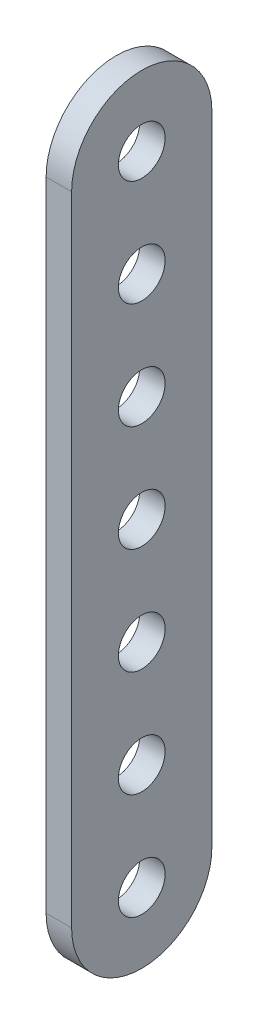
ISO-10303-21;
HEADER;
FILE_DESCRIPTION(('STEP AP214'),'2;1');
FILE_NAME('part.step','',(''),(''),'','','');
FILE_SCHEMA(('AUTOMOTIVE_DESIGN { 1 0 10303 214 1 1 1 1 }'));
ENDSEC;
DATA;
#1=APPLICATION_CONTEXT('core data for automotive mechanical design processes');
#2=APPLICATION_PROTOCOL_DEFINITION('international standard','automotive_design',2000,#1);
#3=PRODUCT_CONTEXT('',#1,'mechanical');
#4=PRODUCT('Part','Part','',(#3));
#5=PRODUCT_RELATED_PRODUCT_CATEGORY('part','',(#4));
#6=PRODUCT_DEFINITION_FORMATION('','',#4);
#7=PRODUCT_DEFINITION_CONTEXT('part definition',#1,'design');
#8=PRODUCT_DEFINITION('design','',#6,#7);
#9=PRODUCT_DEFINITION_SHAPE('','',#8);
#10=(LENGTH_UNIT() NAMED_UNIT(*) SI_UNIT(.MILLI.,.METRE.));
#11=(NAMED_UNIT(*) PLANE_ANGLE_UNIT() SI_UNIT($,.RADIAN.));
#12=(NAMED_UNIT(*) SI_UNIT($,.STERADIAN.) SOLID_ANGLE_UNIT());
#13=UNCERTAINTY_MEASURE_WITH_UNIT(LENGTH_MEASURE(1.E-05),#10,'distance_accuracy_value','');
#14=(GEOMETRIC_REPRESENTATION_CONTEXT(3) GLOBAL_UNCERTAINTY_ASSIGNED_CONTEXT((#13)) GLOBAL_UNIT_ASSIGNED_CONTEXT((#10,
#11,#12)) REPRESENTATION_CONTEXT('',''));
#15=CARTESIAN_POINT('',(0.,0.,0.));
#16=DIRECTION('',(0.,0.,1.));
#17=DIRECTION('',(1.,0.,0.));
#18=AXIS2_PLACEMENT_3D('',#15,#16,#17);
#19=CARTESIAN_POINT('',(18.0582190859894,42.5000000000003,-49.9999999999998));
#20=DIRECTION('',(1.,0.,0.));
#21=DIRECTION('',(0.,0.,-1.));
#22=AXIS2_PLACEMENT_3D('',#19,#20,#21);
#23=PLANE('',#22);
#24=CARTESIAN_POINT('',(18.0582190859894,-20.,-49.9999999999998));
#25=DIRECTION('',(1.,0.,0.));
#26=DIRECTION('',(0.,0.,-1.));
#27=AXIS2_PLACEMENT_3D('',#24,#25,#26);
#28=CIRCLE('',#27,2.74999999999998);
#29=CARTESIAN_POINT('',(18.0582190859894,-20.,-52.7499999999998));
#30=VERTEX_POINT('',#29);
#31=EDGE_CURVE('E180',#30,#30,#28,.T.);
#32=ORIENTED_EDGE('',*,*,#31,.F.);
#33=EDGE_LOOP('',(#32));
#34=FACE_BOUND('',#33,.T.);
#35=CARTESIAN_POINT('',(18.0582190859894,30.0000000000002,-49.9999999999998));
#36=DIRECTION('',(1.,0.,0.));
#37=DIRECTION('',(0.,0.,-1.));
#38=AXIS2_PLACEMENT_3D('',#35,#36,#37);
#39=CIRCLE('',#38,2.74999999999998);
#40=CARTESIAN_POINT('',(18.0582190859894,30.0000000000002,-52.7499999999998));
#41=VERTEX_POINT('',#40);
#42=EDGE_CURVE('E163',#41,#41,#39,.T.);
#43=ORIENTED_EDGE('',*,*,#42,.F.);
#44=EDGE_LOOP('',(#43));
#45=FACE_BOUND('',#44,.T.);
#46=CARTESIAN_POINT('',(18.0582190859894,5.00000000000013,-49.9999999999998));
#47=DIRECTION('',(1.,0.,0.));
#48=DIRECTION('',(0.,0.,-1.));
#49=AXIS2_PLACEMENT_3D('',#46,#47,#48);
#50=CIRCLE('',#49,2.74999999999998);
#51=CARTESIAN_POINT('',(18.0582190859894,5.00000000000013,-52.7499999999998));
#52=VERTEX_POINT('',#51);
#53=EDGE_CURVE('E148',#52,#52,#50,.T.);
#54=ORIENTED_EDGE('',*,*,#53,.F.);
#55=EDGE_LOOP('',(#54));
#56=FACE_BOUND('',#55,.T.);
#57=CARTESIAN_POINT('',(18.0582190859894,42.5000000000003,-49.9999999999998));
#58=DIRECTION('',(1.,0.,0.));
#59=DIRECTION('',(0.,0.,-1.));
#60=AXIS2_PLACEMENT_3D('',#57,#58,#59);
#61=CIRCLE('',#60,8.24999999999998);
#62=CARTESIAN_POINT('',(18.0582190859894,42.5000000000003,-58.2499999999998));
#63=VERTEX_POINT('',#62);
#64=CARTESIAN_POINT('',(18.0582190859894,42.5000000000003,-41.7499999999998));
#65=VERTEX_POINT('',#64);
#66=EDGE_CURVE('E107',#63,#65,#61,.T.);
#67=ORIENTED_EDGE('',*,*,#66,.T.);
#68=DIRECTION('',(0.,-1.,0.));
#69=VECTOR('',#68,1.);
#70=CARTESIAN_POINT('',(18.0582190859894,42.5000000000003,-41.7499999999998));
#71=LINE('',#70,#69);
#72=CARTESIAN_POINT('',(18.0582190859894,-32.5000000000001,-41.7499999999998));
#73=VERTEX_POINT('',#72);
#74=EDGE_CURVE('E102',#65,#73,#71,.T.);
#75=ORIENTED_EDGE('',*,*,#74,.T.);
#76=CARTESIAN_POINT('',(18.0582190859894,-32.5000000000001,-49.9999999999998));
#77=DIRECTION('',(1.,0.,0.));
#78=DIRECTION('',(0.,0.,-1.));
#79=AXIS2_PLACEMENT_3D('',#76,#77,#78);
#80=CIRCLE('',#79,8.24999999999998);
#81=CARTESIAN_POINT('',(18.0582190859894,-32.5000000000001,-58.2499999999998));
#82=VERTEX_POINT('',#81);
#83=EDGE_CURVE('E105',#73,#82,#80,.T.);
#84=ORIENTED_EDGE('',*,*,#83,.T.);
#85=DIRECTION('',(0.,1.,0.));
#86=VECTOR('',#85,1.);
#87=CARTESIAN_POINT('',(18.0582190859894,42.5000000000003,-58.2499999999998));
#88=LINE('',#87,#86);
#89=EDGE_CURVE('E72',#82,#63,#88,.T.);
#90=ORIENTED_EDGE('',*,*,#89,.T.);
#91=EDGE_LOOP('',(#67,#75,#84,#90));
#92=FACE_BOUND('',#91,.T.);
#93=CARTESIAN_POINT('',(18.0582190859894,-7.49999999999994,-49.9999999999998));
#94=DIRECTION('',(1.,0.,0.));
#95=DIRECTION('',(0.,0.,-1.));
#96=AXIS2_PLACEMENT_3D('',#93,#94,#95);
#97=CIRCLE('',#96,2.74999999999998);
#98=CARTESIAN_POINT('',(18.0582190859894,-7.49999999999994,-52.7499999999998));
#99=VERTEX_POINT('',#98);
#100=EDGE_CURVE('E136',#99,#99,#97,.T.);
#101=ORIENTED_EDGE('',*,*,#100,.F.);
#102=EDGE_LOOP('',(#101));
#103=FACE_BOUND('',#102,.T.);
#104=CARTESIAN_POINT('',(18.0582190859894,17.5000000000002,-49.9999999999998));
#105=DIRECTION('',(1.,0.,0.));
#106=DIRECTION('',(0.,0.,-1.));
#107=AXIS2_PLACEMENT_3D('',#104,#105,#106);
#108=CIRCLE('',#107,2.74999999999998);
#109=CARTESIAN_POINT('',(18.0582190859894,17.5000000000002,-52.7499999999998));
#110=VERTEX_POINT('',#109);
#111=EDGE_CURVE('E162',#110,#110,#108,.T.);
#112=ORIENTED_EDGE('',*,*,#111,.F.);
#113=EDGE_LOOP('',(#112));
#114=FACE_BOUND('',#113,.T.);
#115=CARTESIAN_POINT('',(18.0582190859894,42.5000000000003,-49.9999999999998));
#116=DIRECTION('',(1.,0.,0.));
#117=DIRECTION('',(0.,0.,-1.));
#118=AXIS2_PLACEMENT_3D('',#115,#116,#117);
#119=CIRCLE('',#118,2.75);
#120=CARTESIAN_POINT('',(18.0582190859894,42.5000000000003,-52.7499999999998));
#121=VERTEX_POINT('',#120);
#122=EDGE_CURVE('E171',#121,#121,#119,.T.);
#123=ORIENTED_EDGE('',*,*,#122,.F.);
#124=EDGE_LOOP('',(#123));
#125=FACE_BOUND('',#124,.T.);
#126=CARTESIAN_POINT('',(18.0582190859894,-32.5000000000001,-49.9999999999998));
#127=DIRECTION('',(1.,0.,0.));
#128=DIRECTION('',(0.,0.,-1.));
#129=AXIS2_PLACEMENT_3D('',#126,#127,#128);
#130=CIRCLE('',#129,2.74999999999998);
#131=CARTESIAN_POINT('',(18.0582190859894,-32.5000000000001,-52.7499999999998));
#132=VERTEX_POINT('',#131);
#133=EDGE_CURVE('E189',#132,#132,#130,.T.);
#134=ORIENTED_EDGE('',*,*,#133,.F.);
#135=EDGE_LOOP('',(#134));
#136=FACE_BOUND('',#135,.T.);
#137=ADVANCED_FACE('F54',(#34,#45,#56,#92,#103,#114,#125,#136),#23,.T.);
#138=CARTESIAN_POINT('',(15.0582190859894,42.5000000000003,-49.9999999999998));
#139=DIRECTION('',(1.,0.,0.));
#140=DIRECTION('',(0.,0.,-1.));
#141=AXIS2_PLACEMENT_3D('',#138,#139,#140);
#142=PLANE('',#141);
#143=CARTESIAN_POINT('',(15.0582190859894,42.5000000000003,-49.9999999999998));
#144=DIRECTION('',(1.,0.,0.));
#145=DIRECTION('',(0.,0.,-1.));
#146=AXIS2_PLACEMENT_3D('',#143,#144,#145);
#147=CIRCLE('',#146,8.24999999999998);
#148=CARTESIAN_POINT('',(15.0582190859894,42.5000000000003,-58.2499999999998));
#149=VERTEX_POINT('',#148);
#150=CARTESIAN_POINT('',(15.0582190859894,42.5000000000003,-41.7499999999998));
#151=VERTEX_POINT('',#150);
#152=EDGE_CURVE('E142',#149,#151,#147,.T.);
#153=ORIENTED_EDGE('',*,*,#152,.F.);
#154=DIRECTION('',(0.,1.,0.));
#155=VECTOR('',#154,1.);
#156=CARTESIAN_POINT('',(15.0582190859894,42.5000000000003,-58.2499999999998));
#157=LINE('',#156,#155);
#158=CARTESIAN_POINT('',(15.0582190859894,-32.5000000000001,-58.2499999999998));
#159=VERTEX_POINT('',#158);
#160=EDGE_CURVE('E95',#159,#149,#157,.T.);
#161=ORIENTED_EDGE('',*,*,#160,.F.);
#162=CARTESIAN_POINT('',(15.0582190859894,-32.5000000000001,-49.9999999999998));
#163=DIRECTION('',(1.,0.,0.));
#164=DIRECTION('',(0.,0.,-1.));
#165=AXIS2_PLACEMENT_3D('',#162,#163,#164);
#166=CIRCLE('',#165,8.24999999999998);
#167=CARTESIAN_POINT('',(15.0582190859894,-32.5000000000001,-41.7499999999998));
#168=VERTEX_POINT('',#167);
#169=EDGE_CURVE('E89',#168,#159,#166,.T.);
#170=ORIENTED_EDGE('',*,*,#169,.F.);
#171=DIRECTION('',(0.,-1.,0.));
#172=VECTOR('',#171,1.);
#173=CARTESIAN_POINT('',(15.0582190859894,42.5000000000003,-41.7499999999998));
#174=LINE('',#173,#172);
#175=EDGE_CURVE('E112',#151,#168,#174,.T.);
#176=ORIENTED_EDGE('',*,*,#175,.F.);
#177=EDGE_LOOP('',(#153,#161,#170,#176));
#178=FACE_BOUND('',#177,.T.);
#179=CARTESIAN_POINT('',(15.0582190859894,-7.49999999999994,-49.9999999999998));
#180=DIRECTION('',(1.,0.,0.));
#181=DIRECTION('',(0.,0.,-1.));
#182=AXIS2_PLACEMENT_3D('',#179,#180,#181);
#183=CIRCLE('',#182,2.74999999999998);
#184=CARTESIAN_POINT('',(15.0582190859894,-7.49999999999994,-52.7499999999998));
#185=VERTEX_POINT('',#184);
#186=EDGE_CURVE('E143',#185,#185,#183,.T.);
#187=ORIENTED_EDGE('',*,*,#186,.T.);
#188=EDGE_LOOP('',(#187));
#189=FACE_BOUND('',#188,.T.);
#190=CARTESIAN_POINT('',(15.0582190859894,5.00000000000013,-49.9999999999998));
#191=DIRECTION('',(1.,0.,0.));
#192=DIRECTION('',(0.,0.,-1.));
#193=AXIS2_PLACEMENT_3D('',#190,#191,#192);
#194=CIRCLE('',#193,2.74999999999998);
#195=CARTESIAN_POINT('',(15.0582190859894,5.00000000000013,-52.7499999999998));
#196=VERTEX_POINT('',#195);
#197=EDGE_CURVE('E144',#196,#196,#194,.T.);
#198=ORIENTED_EDGE('',*,*,#197,.T.);
#199=EDGE_LOOP('',(#198));
#200=FACE_BOUND('',#199,.T.);
#201=CARTESIAN_POINT('',(15.0582190859894,17.5000000000002,-49.9999999999998));
#202=DIRECTION('',(1.,0.,0.));
#203=DIRECTION('',(0.,0.,-1.));
#204=AXIS2_PLACEMENT_3D('',#201,#202,#203);
#205=CIRCLE('',#204,2.74999999999998);
#206=CARTESIAN_POINT('',(15.0582190859894,17.5000000000002,-52.7499999999998));
#207=VERTEX_POINT('',#206);
#208=EDGE_CURVE('E159',#207,#207,#205,.T.);
#209=ORIENTED_EDGE('',*,*,#208,.T.);
#210=EDGE_LOOP('',(#209));
#211=FACE_BOUND('',#210,.T.);
#212=CARTESIAN_POINT('',(15.0582190859894,30.0000000000002,-49.9999999999998));
#213=DIRECTION('',(1.,0.,0.));
#214=DIRECTION('',(0.,0.,-1.));
#215=AXIS2_PLACEMENT_3D('',#212,#213,#214);
#216=CIRCLE('',#215,2.74999999999998);
#217=CARTESIAN_POINT('',(15.0582190859894,30.0000000000002,-52.7499999999998));
#218=VERTEX_POINT('',#217);
#219=EDGE_CURVE('E168',#218,#218,#216,.T.);
#220=ORIENTED_EDGE('',*,*,#219,.T.);
#221=EDGE_LOOP('',(#220));
#222=FACE_BOUND('',#221,.T.);
#223=CARTESIAN_POINT('',(15.0582190859894,42.5000000000003,-49.9999999999998));
#224=DIRECTION('',(1.,0.,0.));
#225=DIRECTION('',(0.,0.,-1.));
#226=AXIS2_PLACEMENT_3D('',#223,#224,#225);
#227=CIRCLE('',#226,2.75);
#228=CARTESIAN_POINT('',(15.0582190859894,42.5000000000003,-52.7499999999998));
#229=VERTEX_POINT('',#228);
#230=EDGE_CURVE('E176',#229,#229,#227,.T.);
#231=ORIENTED_EDGE('',*,*,#230,.T.);
#232=EDGE_LOOP('',(#231));
#233=FACE_BOUND('',#232,.T.);
#234=CARTESIAN_POINT('',(15.0582190859894,-20.,-49.9999999999998));
#235=DIRECTION('',(1.,0.,0.));
#236=DIRECTION('',(0.,0.,-1.));
#237=AXIS2_PLACEMENT_3D('',#234,#235,#236);
#238=CIRCLE('',#237,2.74999999999998);
#239=CARTESIAN_POINT('',(15.0582190859894,-20.,-52.7499999999998));
#240=VERTEX_POINT('',#239);
#241=EDGE_CURVE('E185',#240,#240,#238,.T.);
#242=ORIENTED_EDGE('',*,*,#241,.T.);
#243=EDGE_LOOP('',(#242));
#244=FACE_BOUND('',#243,.T.);
#245=CARTESIAN_POINT('',(15.0582190859894,-32.5000000000001,-49.9999999999998));
#246=DIRECTION('',(1.,0.,0.));
#247=DIRECTION('',(0.,0.,-1.));
#248=AXIS2_PLACEMENT_3D('',#245,#246,#247);
#249=CIRCLE('',#248,2.74999999999998);
#250=CARTESIAN_POINT('',(15.0582190859894,-32.5000000000001,-52.7499999999998));
#251=VERTEX_POINT('',#250);
#252=EDGE_CURVE('E194',#251,#251,#249,.T.);
#253=ORIENTED_EDGE('',*,*,#252,.T.);
#254=EDGE_LOOP('',(#253));
#255=FACE_BOUND('',#254,.T.);
#256=ADVANCED_FACE('F209',(#178,#189,#200,#211,#222,#233,#244,#255),#142,.F.);
#257=CARTESIAN_POINT('',(18.0582190859894,42.5000000000003,-49.9999999999998));
#258=DIRECTION('',(-1.,0.,0.));
#259=DIRECTION('',(0.,0.,1.));
#260=AXIS2_PLACEMENT_3D('',#257,#258,#259);
#261=CYLINDRICAL_SURFACE('',#260,8.24999999999998);
#262=ORIENTED_EDGE('',*,*,#152,.T.);
#263=DIRECTION('',(-1.,0.,0.));
#264=VECTOR('',#263,1.);
#265=CARTESIAN_POINT('',(18.0582190859894,42.5000000000003,-41.7499999999998));
#266=LINE('',#265,#264);
#267=EDGE_CURVE('E12',#65,#151,#266,.T.);
#268=ORIENTED_EDGE('',*,*,#267,.F.);
#269=ORIENTED_EDGE('',*,*,#66,.F.);
#270=DIRECTION('',(-1.,0.,0.));
#271=VECTOR('',#270,1.);
#272=CARTESIAN_POINT('',(18.0582190859894,42.5000000000003,-58.2499999999998));
#273=LINE('',#272,#271);
#274=EDGE_CURVE('E121',#63,#149,#273,.T.);
#275=ORIENTED_EDGE('',*,*,#274,.T.);
#276=EDGE_LOOP('',(#262,#268,#269,#275));
#277=FACE_BOUND('',#276,.T.);
#278=ADVANCED_FACE('F56',(#277),#261,.T.);
#279=CARTESIAN_POINT('',(18.0582190859894,42.5000000000003,-41.7499999999998));
#280=DIRECTION('',(0.,0.,-1.));
#281=DIRECTION('',(0.,1.,0.));
#282=AXIS2_PLACEMENT_3D('',#279,#280,#281);
#283=PLANE('',#282);
#284=ORIENTED_EDGE('',*,*,#175,.T.);
#285=DIRECTION('',(-1.,0.,0.));
#286=VECTOR('',#285,1.);
#287=CARTESIAN_POINT('',(18.0582190859894,-32.5000000000001,-41.7499999999998));
#288=LINE('',#287,#286);
#289=EDGE_CURVE('E64',#73,#168,#288,.T.);
#290=ORIENTED_EDGE('',*,*,#289,.F.);
#291=ORIENTED_EDGE('',*,*,#74,.F.);
#292=ORIENTED_EDGE('',*,*,#267,.T.);
#293=EDGE_LOOP('',(#284,#290,#291,#292));
#294=FACE_BOUND('',#293,.T.);
#295=ADVANCED_FACE('F111',(#294),#283,.F.);
#296=CARTESIAN_POINT('',(18.0582190859894,-32.5000000000001,-49.9999999999998));
#297=DIRECTION('',(-1.,0.,0.));
#298=DIRECTION('',(0.,0.,1.));
#299=AXIS2_PLACEMENT_3D('',#296,#297,#298);
#300=CYLINDRICAL_SURFACE('',#299,8.24999999999998);
#301=ORIENTED_EDGE('',*,*,#169,.T.);
#302=DIRECTION('',(-1.,0.,0.));
#303=VECTOR('',#302,1.);
#304=CARTESIAN_POINT('',(18.0582190859894,-32.5000000000001,-58.2499999999998));
#305=LINE('',#304,#303);
#306=EDGE_CURVE('E114',#82,#159,#305,.T.);
#307=ORIENTED_EDGE('',*,*,#306,.F.);
#308=ORIENTED_EDGE('',*,*,#83,.F.);
#309=ORIENTED_EDGE('',*,*,#289,.T.);
#310=EDGE_LOOP('',(#301,#307,#308,#309));
#311=FACE_BOUND('',#310,.T.);
#312=ADVANCED_FACE('F115',(#311),#300,.T.);
#313=CARTESIAN_POINT('',(18.0582190859894,42.5000000000003,-58.2499999999998));
#314=DIRECTION('',(0.,0.,1.));
#315=DIRECTION('',(0.,-1.,0.));
#316=AXIS2_PLACEMENT_3D('',#313,#314,#315);
#317=PLANE('',#316);
#318=ORIENTED_EDGE('',*,*,#160,.T.);
#319=ORIENTED_EDGE('',*,*,#274,.F.);
#320=ORIENTED_EDGE('',*,*,#89,.F.);
#321=ORIENTED_EDGE('',*,*,#306,.T.);
#322=EDGE_LOOP('',(#318,#319,#320,#321));
#323=FACE_BOUND('',#322,.T.);
#324=ADVANCED_FACE('F222',(#323),#317,.F.);
#325=CARTESIAN_POINT('',(18.0582190859894,-7.49999999999994,-49.9999999999998));
#326=DIRECTION('',(-1.,0.,0.));
#327=DIRECTION('',(0.,0.,1.));
#328=AXIS2_PLACEMENT_3D('',#325,#326,#327);
#329=CYLINDRICAL_SURFACE('',#328,2.74999999999998);
#330=ORIENTED_EDGE('',*,*,#100,.T.);
#331=EDGE_LOOP('',(#330));
#332=FACE_BOUND('',#331,.T.);
#333=ORIENTED_EDGE('',*,*,#186,.F.);
#334=EDGE_LOOP('',(#333));
#335=FACE_BOUND('',#334,.T.);
#336=ADVANCED_FACE('F219',(#332,#335),#329,.F.);
#337=CARTESIAN_POINT('',(18.0582190859894,5.00000000000013,-49.9999999999998));
#338=DIRECTION('',(-1.,0.,0.));
#339=DIRECTION('',(0.,0.,1.));
#340=AXIS2_PLACEMENT_3D('',#337,#338,#339);
#341=CYLINDRICAL_SURFACE('',#340,2.74999999999998);
#342=ORIENTED_EDGE('',*,*,#53,.T.);
#343=EDGE_LOOP('',(#342));
#344=FACE_BOUND('',#343,.T.);
#345=ORIENTED_EDGE('',*,*,#197,.F.);
#346=EDGE_LOOP('',(#345));
#347=FACE_BOUND('',#346,.T.);
#348=ADVANCED_FACE('F275',(#344,#347),#341,.F.);
#349=CARTESIAN_POINT('',(18.0582190859894,17.5000000000002,-49.9999999999998));
#350=DIRECTION('',(-1.,0.,0.));
#351=DIRECTION('',(0.,0.,1.));
#352=AXIS2_PLACEMENT_3D('',#349,#350,#351);
#353=CYLINDRICAL_SURFACE('',#352,2.74999999999998);
#354=ORIENTED_EDGE('',*,*,#111,.T.);
#355=EDGE_LOOP('',(#354));
#356=FACE_BOUND('',#355,.T.);
#357=ORIENTED_EDGE('',*,*,#208,.F.);
#358=EDGE_LOOP('',(#357));
#359=FACE_BOUND('',#358,.T.);
#360=ADVANCED_FACE('F272',(#356,#359),#353,.F.);
#361=CARTESIAN_POINT('',(18.0582190859894,30.0000000000002,-49.9999999999998));
#362=DIRECTION('',(-1.,0.,0.));
#363=DIRECTION('',(0.,0.,1.));
#364=AXIS2_PLACEMENT_3D('',#361,#362,#363);
#365=CYLINDRICAL_SURFACE('',#364,2.74999999999998);
#366=ORIENTED_EDGE('',*,*,#42,.T.);
#367=EDGE_LOOP('',(#366));
#368=FACE_BOUND('',#367,.T.);
#369=ORIENTED_EDGE('',*,*,#219,.F.);
#370=EDGE_LOOP('',(#369));
#371=FACE_BOUND('',#370,.T.);
#372=ADVANCED_FACE('F268',(#368,#371),#365,.F.);
#373=CARTESIAN_POINT('',(18.0582190859894,42.5000000000003,-49.9999999999998));
#374=DIRECTION('',(-1.,0.,0.));
#375=DIRECTION('',(0.,0.,1.));
#376=AXIS2_PLACEMENT_3D('',#373,#374,#375);
#377=CYLINDRICAL_SURFACE('',#376,2.75);
#378=ORIENTED_EDGE('',*,*,#122,.T.);
#379=EDGE_LOOP('',(#378));
#380=FACE_BOUND('',#379,.T.);
#381=ORIENTED_EDGE('',*,*,#230,.F.);
#382=EDGE_LOOP('',(#381));
#383=FACE_BOUND('',#382,.T.);
#384=ADVANCED_FACE('F262',(#380,#383),#377,.F.);
#385=CARTESIAN_POINT('',(18.0582190859894,-20.,-49.9999999999998));
#386=DIRECTION('',(-1.,0.,0.));
#387=DIRECTION('',(0.,0.,1.));
#388=AXIS2_PLACEMENT_3D('',#385,#386,#387);
#389=CYLINDRICAL_SURFACE('',#388,2.74999999999998);
#390=ORIENTED_EDGE('',*,*,#31,.T.);
#391=EDGE_LOOP('',(#390));
#392=FACE_BOUND('',#391,.T.);
#393=ORIENTED_EDGE('',*,*,#241,.F.);
#394=EDGE_LOOP('',(#393));
#395=FACE_BOUND('',#394,.T.);
#396=ADVANCED_FACE('F258',(#392,#395),#389,.F.);
#397=CARTESIAN_POINT('',(18.0582190859894,-32.5000000000001,-49.9999999999998));
#398=DIRECTION('',(-1.,0.,0.));
#399=DIRECTION('',(0.,0.,1.));
#400=AXIS2_PLACEMENT_3D('',#397,#398,#399);
#401=CYLINDRICAL_SURFACE('',#400,2.74999999999998);
#402=ORIENTED_EDGE('',*,*,#133,.T.);
#403=EDGE_LOOP('',(#402));
#404=FACE_BOUND('',#403,.T.);
#405=ORIENTED_EDGE('',*,*,#252,.F.);
#406=EDGE_LOOP('',(#405));
#407=FACE_BOUND('',#406,.T.);
#408=ADVANCED_FACE('F205',(#404,#407),#401,.F.);
#409=CLOSED_SHELL('',(#137,#256,#278,#295,#312,#324,#336,#348,#360,#372,#384,#396,#408));
#410=MANIFOLD_SOLID_BREP('B2',#409);
#411=ADVANCED_BREP_SHAPE_REPRESENTATION('',(#18,#410),#14);
#412=SHAPE_DEFINITION_REPRESENTATION(#9,#411);
ENDSEC;
END-ISO-10303-21;
